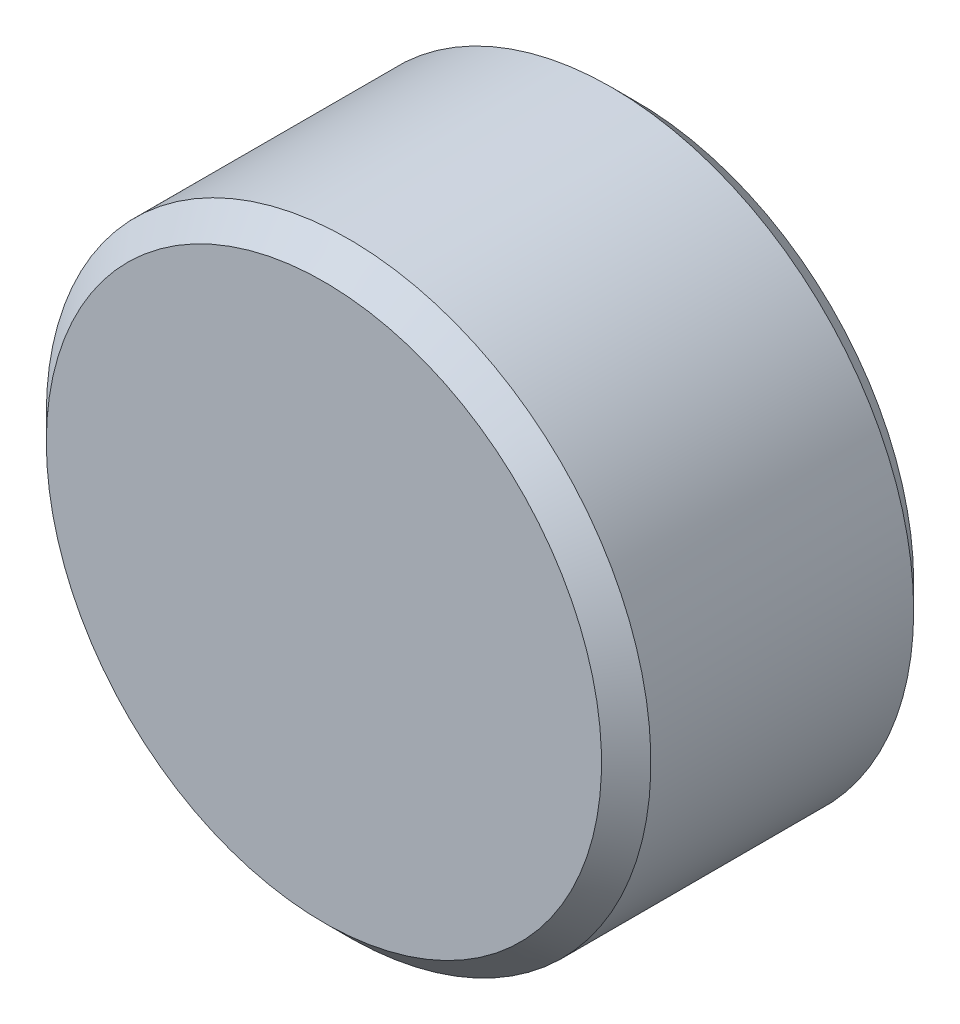
ISO-10303-21;
HEADER;
FILE_DESCRIPTION(('STEP AP214'),'2;1');
FILE_NAME('part.step','',(''),(''),'','','');
FILE_SCHEMA(('AUTOMOTIVE_DESIGN { 1 0 10303 214 1 1 1 1 }'));
ENDSEC;
DATA;
#1=APPLICATION_CONTEXT('core data for automotive mechanical design processes');
#2=APPLICATION_PROTOCOL_DEFINITION('international standard','automotive_design',2000,#1);
#3=PRODUCT_CONTEXT('',#1,'mechanical');
#4=PRODUCT('Part','Part','',(#3));
#5=PRODUCT_RELATED_PRODUCT_CATEGORY('part','',(#4));
#6=PRODUCT_DEFINITION_FORMATION('','',#4);
#7=PRODUCT_DEFINITION_CONTEXT('part definition',#1,'design');
#8=PRODUCT_DEFINITION('design','',#6,#7);
#9=PRODUCT_DEFINITION_SHAPE('','',#8);
#10=(LENGTH_UNIT() NAMED_UNIT(*) SI_UNIT(.MILLI.,.METRE.));
#11=(NAMED_UNIT(*) PLANE_ANGLE_UNIT() SI_UNIT($,.RADIAN.));
#12=(NAMED_UNIT(*) SI_UNIT($,.STERADIAN.) SOLID_ANGLE_UNIT());
#13=UNCERTAINTY_MEASURE_WITH_UNIT(LENGTH_MEASURE(1.E-05),#10,'distance_accuracy_value','');
#14=(GEOMETRIC_REPRESENTATION_CONTEXT(3) GLOBAL_UNCERTAINTY_ASSIGNED_CONTEXT((#13)) GLOBAL_UNIT_ASSIGNED_CONTEXT((#10,
#11,#12)) REPRESENTATION_CONTEXT('',''));
#15=CARTESIAN_POINT('',(0.,0.,0.));
#16=DIRECTION('',(0.,0.,1.));
#17=DIRECTION('',(1.,0.,0.));
#18=AXIS2_PLACEMENT_3D('',#15,#16,#17);
#19=CARTESIAN_POINT('',(0.,0.,6.4262));
#20=DIRECTION('',(0.,0.,-1.));
#21=DIRECTION('',(-1.,0.,0.));
#22=AXIS2_PLACEMENT_3D('',#19,#20,#21);
#23=CYLINDRICAL_SURFACE('',#22,6.223);
#24=CARTESIAN_POINT('',(0.,0.,0.507999999999999));
#25=DIRECTION('',(0.,0.,1.));
#26=DIRECTION('',(1.,0.,0.));
#27=AXIS2_PLACEMENT_3D('',#24,#25,#26);
#28=CIRCLE('',#27,6.223);
#29=CARTESIAN_POINT('',(6.223,0.,0.507999999999999));
#30=VERTEX_POINT('',#29);
#31=EDGE_CURVE('E228',#30,#30,#28,.T.);
#32=ORIENTED_EDGE('',*,*,#31,.T.);
#33=EDGE_LOOP('',(#32));
#34=FACE_BOUND('',#33,.T.);
#35=CARTESIAN_POINT('',(0.,0.,5.9182));
#36=DIRECTION('',(0.,0.,1.));
#37=DIRECTION('',(1.,0.,0.));
#38=AXIS2_PLACEMENT_3D('',#35,#36,#37);
#39=CIRCLE('',#38,6.223);
#40=CARTESIAN_POINT('',(-6.223,0.,5.9182));
#41=VERTEX_POINT('',#40);
#42=EDGE_CURVE('E234',#41,#41,#39,.F.);
#43=ORIENTED_EDGE('',*,*,#42,.T.);
#44=EDGE_LOOP('',(#43));
#45=FACE_BOUND('',#44,.T.);
#46=ADVANCED_FACE('F212',(#34,#45),#23,.T.);
#47=CARTESIAN_POINT('',(0.,0.,6.4262));
#48=DIRECTION('',(0.,0.,1.));
#49=DIRECTION('',(1.,0.,0.));
#50=AXIS2_PLACEMENT_3D('',#47,#48,#49);
#51=PLANE('',#50);
#52=CARTESIAN_POINT('',(0.,0.,6.4262));
#53=DIRECTION('',(0.,0.,1.));
#54=DIRECTION('',(1.,0.,0.));
#55=AXIS2_PLACEMENT_3D('',#52,#53,#54);
#56=CIRCLE('',#55,5.715);
#57=CARTESIAN_POINT('',(-5.715,0.,6.4262));
#58=VERTEX_POINT('',#57);
#59=EDGE_CURVE('E11',#58,#58,#56,.T.);
#60=ORIENTED_EDGE('',*,*,#59,.T.);
#61=EDGE_LOOP('',(#60));
#62=FACE_BOUND('',#61,.T.);
#63=ADVANCED_FACE('F250',(#62),#51,.T.);
#64=CARTESIAN_POINT('',(0.,0.,0.));
#65=DIRECTION('',(0.,0.,1.));
#66=DIRECTION('',(1.,0.,0.));
#67=AXIS2_PLACEMENT_3D('',#64,#65,#66);
#68=PLANE('',#67);
#69=CARTESIAN_POINT('',(0.,0.,0.));
#70=DIRECTION('',(0.,0.,1.));
#71=DIRECTION('',(1.,0.,0.));
#72=AXIS2_PLACEMENT_3D('',#69,#70,#71);
#73=CIRCLE('',#72,5.715);
#74=CARTESIAN_POINT('',(5.715,0.,0.));
#75=VERTEX_POINT('',#74);
#76=EDGE_CURVE('E221',#75,#75,#73,.F.);
#77=ORIENTED_EDGE('',*,*,#76,.T.);
#78=EDGE_LOOP('',(#77));
#79=FACE_BOUND('',#78,.T.);
#80=ADVANCED_FACE('F247',(#79),#68,.F.);
#81=CARTESIAN_POINT('',(0.,0.,0.507999999999999));
#82=DIRECTION('',(0.,0.,1.));
#83=DIRECTION('',(1.,0.,0.));
#84=AXIS2_PLACEMENT_3D('',#81,#82,#83);
#85=CONICAL_SURFACE('',#84,6.223,0.785398163397448);
#86=ORIENTED_EDGE('',*,*,#76,.F.);
#87=EDGE_LOOP('',(#86));
#88=FACE_BOUND('',#87,.T.);
#89=ORIENTED_EDGE('',*,*,#31,.F.);
#90=EDGE_LOOP('',(#89));
#91=FACE_BOUND('',#90,.T.);
#92=ADVANCED_FACE('F244',(#88,#91),#85,.T.);
#93=CARTESIAN_POINT('',(0.,0.,6.4262));
#94=DIRECTION('',(0.,0.,-1.));
#95=DIRECTION('',(-1.,0.,0.));
#96=AXIS2_PLACEMENT_3D('',#93,#94,#95);
#97=CONICAL_SURFACE('',#96,5.715,0.785398163397444);
#98=CARTESIAN_POINT('',(-6.223,0.,5.9182));
#99=CARTESIAN_POINT('',(-6.21770833333333,0.,5.92349166666666));
#100=CARTESIAN_POINT('',(-6.21241666666667,0.,5.92878333333333));
#101=CARTESIAN_POINT('',(-6.20183333333333,0.,5.93936666666666));
#102=CARTESIAN_POINT('',(-6.19654166666667,0.,5.94465833333333));
#103=CARTESIAN_POINT('',(-6.18595833333333,0.,5.95524166666666));
#104=CARTESIAN_POINT('',(-6.18066666666667,0.,5.96053333333333));
#105=CARTESIAN_POINT('',(-6.17008333333333,0.,5.97111666666666));
#106=CARTESIAN_POINT('',(-6.16479166666667,0.,5.97640833333333));
#107=CARTESIAN_POINT('',(-6.15420833333333,0.,5.98699166666666));
#108=CARTESIAN_POINT('',(-6.14891666666667,0.,5.99228333333333));
#109=CARTESIAN_POINT('',(-6.13833333333333,0.,6.00286666666666));
#110=CARTESIAN_POINT('',(-6.13304166666667,0.,6.00815833333333));
#111=CARTESIAN_POINT('',(-6.12245833333333,0.,6.01874166666666));
#112=CARTESIAN_POINT('',(-6.11716666666667,0.,6.02403333333333));
#113=CARTESIAN_POINT('',(-6.10658333333333,0.,6.03461666666666));
#114=CARTESIAN_POINT('',(-6.10129166666667,0.,6.03990833333333));
#115=CARTESIAN_POINT('',(-6.09070833333333,0.,6.05049166666666));
#116=CARTESIAN_POINT('',(-6.08541666666667,0.,6.05578333333333));
#117=CARTESIAN_POINT('',(-6.07483333333333,0.,6.06636666666666));
#118=CARTESIAN_POINT('',(-6.06954166666667,0.,6.07165833333333));
#119=CARTESIAN_POINT('',(-6.05895833333333,0.,6.08224166666666));
#120=CARTESIAN_POINT('',(-6.05366666666667,0.,6.08753333333333));
#121=CARTESIAN_POINT('',(-6.04308333333333,0.,6.09811666666666));
#122=CARTESIAN_POINT('',(-6.03779166666667,0.,6.10340833333333));
#123=CARTESIAN_POINT('',(-6.02720833333333,0.,6.11399166666666));
#124=CARTESIAN_POINT('',(-6.02191666666667,0.,6.11928333333333));
#125=CARTESIAN_POINT('',(-6.01133333333333,0.,6.12986666666666));
#126=CARTESIAN_POINT('',(-6.00604166666667,0.,6.13515833333333));
#127=CARTESIAN_POINT('',(-5.99545833333333,0.,6.14574166666666));
#128=CARTESIAN_POINT('',(-5.99016666666667,0.,6.15103333333333));
#129=CARTESIAN_POINT('',(-5.97958333333333,0.,6.16161666666666));
#130=CARTESIAN_POINT('',(-5.97429166666667,0.,6.16690833333333));
#131=CARTESIAN_POINT('',(-5.96370833333333,0.,6.17749166666666));
#132=CARTESIAN_POINT('',(-5.95841666666667,0.,6.18278333333333));
#133=CARTESIAN_POINT('',(-5.94783333333333,0.,6.19336666666666));
#134=CARTESIAN_POINT('',(-5.94254166666667,0.,6.19865833333333));
#135=CARTESIAN_POINT('',(-5.93195833333333,0.,6.20924166666666));
#136=CARTESIAN_POINT('',(-5.92666666666667,0.,6.21453333333333));
#137=CARTESIAN_POINT('',(-5.91608333333333,0.,6.22511666666666));
#138=CARTESIAN_POINT('',(-5.91079166666667,0.,6.23040833333333));
#139=CARTESIAN_POINT('',(-5.90020833333333,0.,6.24099166666666));
#140=CARTESIAN_POINT('',(-5.89491666666667,0.,6.24628333333333));
#141=CARTESIAN_POINT('',(-5.88433333333333,0.,6.25686666666666));
#142=CARTESIAN_POINT('',(-5.87904166666667,0.,6.26215833333333));
#143=CARTESIAN_POINT('',(-5.86845833333333,0.,6.27274166666666));
#144=CARTESIAN_POINT('',(-5.86316666666667,0.,6.27803333333333));
#145=CARTESIAN_POINT('',(-5.85258333333333,0.,6.28861666666667));
#146=CARTESIAN_POINT('',(-5.84729166666667,0.,6.29390833333333));
#147=CARTESIAN_POINT('',(-5.83670833333333,0.,6.30449166666667));
#148=CARTESIAN_POINT('',(-5.83141666666667,0.,6.30978333333333));
#149=CARTESIAN_POINT('',(-5.82083333333333,0.,6.32036666666667));
#150=CARTESIAN_POINT('',(-5.81554166666667,0.,6.32565833333333));
#151=CARTESIAN_POINT('',(-5.80495833333333,0.,6.33624166666667));
#152=CARTESIAN_POINT('',(-5.79966666666667,0.,6.34153333333333));
#153=CARTESIAN_POINT('',(-5.78908333333333,0.,6.35211666666667));
#154=CARTESIAN_POINT('',(-5.78379166666667,0.,6.35740833333333));
#155=CARTESIAN_POINT('',(-5.77320833333333,0.,6.36799166666666));
#156=CARTESIAN_POINT('',(-5.76791666666667,0.,6.37328333333333));
#157=CARTESIAN_POINT('',(-5.75733333333333,0.,6.38386666666667));
#158=CARTESIAN_POINT('',(-5.75204166666667,0.,6.38915833333333));
#159=CARTESIAN_POINT('',(-5.74145833333333,0.,6.39974166666667));
#160=CARTESIAN_POINT('',(-5.73616666666667,0.,6.40503333333333));
#161=CARTESIAN_POINT('',(-5.72558333333333,0.,6.41561666666667));
#162=CARTESIAN_POINT('',(-5.72029166666667,0.,6.42090833333333));
#163=CARTESIAN_POINT('',(-5.715,0.,6.4262));
#164=B_SPLINE_CURVE_WITH_KNOTS('',3,(#98,#99,#100,#101,#102,#103,#104,#105,#106,#107,#108,#109,
#110,#111,#112,#113,#114,#115,#116,#117,#118,#119,#120,#121,#122,#123,#124,#125,#126,#127,#128,
#129,#130,#131,#132,#133,#134,#135,#136,#137,#138,#139,#140,#141,#142,#143,#144,#145,#146,#147,
#148,#149,#150,#151,#152,#153,#154,#155,#156,#157,#158,#159,#160,#161,#162,#163),.UNSPECIFIED.,
.F.,.F.,(4,2,2,2,2,2,2,2,2,2,2,2,2,2,2,2,2,2,2,2,2,2,2,2,2,2,2,2,2,2,2,2,4),(0.,
0.022450640302672,0.0449012806053453,0.0673519209080179,0.0898025612106912,0.112253201513364,
0.134703841816038,0.15715448211871,0.179605122421383,0.202055762724056,0.224506403026729,
0.246957043329402,0.269407683632075,0.291858323934748,0.314308964237421,0.336759604540094,
0.359210244842767,0.38166088514544,0.404111525448113,0.426562165750786,0.449012806053458,
0.471463446356132,0.493914086658805,0.516364726961478,0.538815367264151,0.561266007566824,
0.583716647869496,0.606167288172169,0.628617928474843,0.651068568777515,0.673519209080188,
0.695969849382862,0.718420489685535),.UNSPECIFIED.);
#165=EDGE_CURVE('BSEAM215',#41,#58,#164,.T.);
#166=ORIENTED_EDGE('',*,*,#42,.F.);
#167=ORIENTED_EDGE('',*,*,#59,.F.);
#168=ORIENTED_EDGE('',*,*,#165,.T.);
#169=ORIENTED_EDGE('',*,*,#165,.F.);
#170=EDGE_LOOP('',(#166,#168,#167,#169));
#171=FACE_BOUND('',#170,.T.);
#172=ADVANCED_FACE('F215',(#171),#97,.T.);
#173=CLOSED_SHELL('',(#46,#63,#80,#92,#172));
#174=MANIFOLD_SOLID_BREP('B2',#173);
#175=ADVANCED_BREP_SHAPE_REPRESENTATION('',(#18,#174),#14);
#176=SHAPE_DEFINITION_REPRESENTATION(#9,#175);
ENDSEC;
END-ISO-10303-21;
